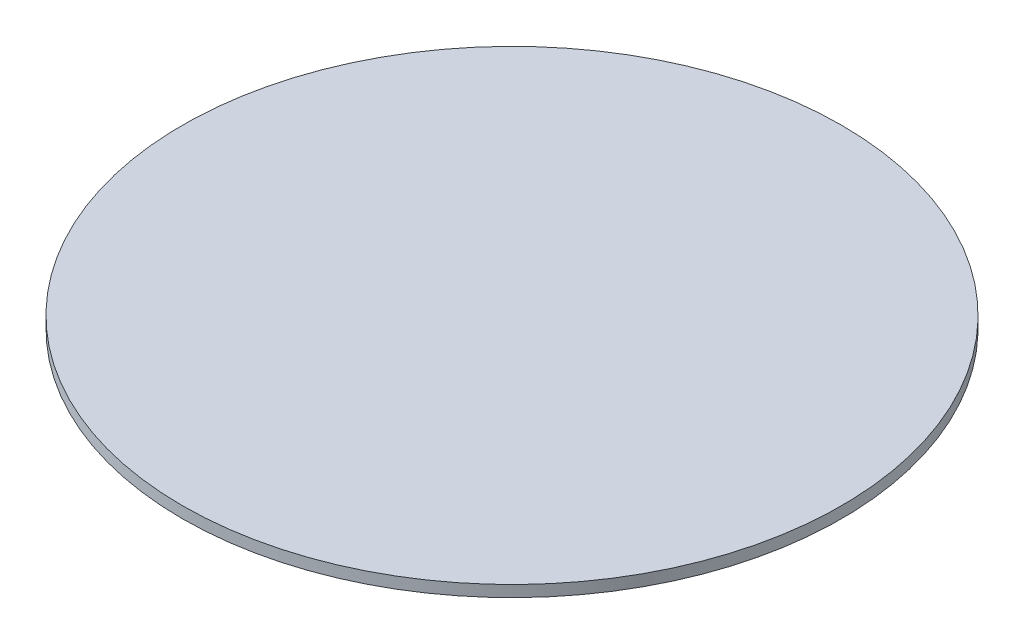
ISO-10303-21;
HEADER;
FILE_DESCRIPTION(('STEP AP214'),'2;1');
FILE_NAME('part.step','',(''),(''),'','','');
FILE_SCHEMA(('AUTOMOTIVE_DESIGN { 1 0 10303 214 1 1 1 1 }'));
ENDSEC;
DATA;
#1=APPLICATION_CONTEXT('core data for automotive mechanical design processes');
#2=APPLICATION_PROTOCOL_DEFINITION('international standard','automotive_design',2000,#1);
#3=PRODUCT_CONTEXT('',#1,'mechanical');
#4=PRODUCT('Part','Part','',(#3));
#5=PRODUCT_RELATED_PRODUCT_CATEGORY('part','',(#4));
#6=PRODUCT_DEFINITION_FORMATION('','',#4);
#7=PRODUCT_DEFINITION_CONTEXT('part definition',#1,'design');
#8=PRODUCT_DEFINITION('design','',#6,#7);
#9=PRODUCT_DEFINITION_SHAPE('','',#8);
#10=(LENGTH_UNIT() NAMED_UNIT(*) SI_UNIT(.MILLI.,.METRE.));
#11=(NAMED_UNIT(*) PLANE_ANGLE_UNIT() SI_UNIT($,.RADIAN.));
#12=(NAMED_UNIT(*) SI_UNIT($,.STERADIAN.) SOLID_ANGLE_UNIT());
#13=UNCERTAINTY_MEASURE_WITH_UNIT(LENGTH_MEASURE(1.E-05),#10,'distance_accuracy_value','');
#14=(GEOMETRIC_REPRESENTATION_CONTEXT(3) GLOBAL_UNCERTAINTY_ASSIGNED_CONTEXT((#13)) GLOBAL_UNIT_ASSIGNED_CONTEXT((#10,
#11,#12)) REPRESENTATION_CONTEXT('',''));
#15=CARTESIAN_POINT('',(0.,0.,0.));
#16=DIRECTION('',(0.,0.,1.));
#17=DIRECTION('',(1.,0.,0.));
#18=AXIS2_PLACEMENT_3D('',#15,#16,#17);
#19=CARTESIAN_POINT('',(0.,3.175,0.));
#20=DIRECTION('',(0.,-1.,0.));
#21=DIRECTION('',(0.,0.,-1.));
#22=AXIS2_PLACEMENT_3D('',#19,#20,#21);
#23=CYLINDRICAL_SURFACE('',#22,92.075);
#24=CARTESIAN_POINT('',(0.,3.175,0.));
#25=DIRECTION('',(0.,1.,0.));
#26=DIRECTION('',(0.,0.,1.));
#27=AXIS2_PLACEMENT_3D('',#24,#25,#26);
#28=CIRCLE('',#27,92.075);
#29=CARTESIAN_POINT('',(0.,3.175,92.075));
#30=VERTEX_POINT('',#29);
#31=EDGE_CURVE('E10',#30,#30,#28,.T.);
#32=ORIENTED_EDGE('',*,*,#31,.F.);
#33=EDGE_LOOP('',(#32));
#34=FACE_BOUND('',#33,.T.);
#35=CARTESIAN_POINT('',(0.,0.,0.));
#36=DIRECTION('',(0.,1.,0.));
#37=DIRECTION('',(0.,0.,1.));
#38=AXIS2_PLACEMENT_3D('',#35,#36,#37);
#39=CIRCLE('',#38,92.075);
#40=CARTESIAN_POINT('',(0.,0.,92.075));
#41=VERTEX_POINT('',#40);
#42=EDGE_CURVE('E35',#41,#41,#39,.T.);
#43=ORIENTED_EDGE('',*,*,#42,.T.);
#44=EDGE_LOOP('',(#43));
#45=FACE_BOUND('',#44,.T.);
#46=ADVANCED_FACE('F32',(#34,#45),#23,.T.);
#47=CARTESIAN_POINT('',(0.,3.175,0.));
#48=DIRECTION('',(0.,1.,0.));
#49=DIRECTION('',(0.,0.,1.));
#50=AXIS2_PLACEMENT_3D('',#47,#48,#49);
#51=PLANE('',#50);
#52=ORIENTED_EDGE('',*,*,#31,.T.);
#53=EDGE_LOOP('',(#52));
#54=FACE_BOUND('',#53,.T.);
#55=ADVANCED_FACE('F47',(#54),#51,.T.);
#56=CARTESIAN_POINT('',(0.,0.,0.));
#57=DIRECTION('',(0.,1.,0.));
#58=DIRECTION('',(0.,0.,1.));
#59=AXIS2_PLACEMENT_3D('',#56,#57,#58);
#60=PLANE('',#59);
#61=ORIENTED_EDGE('',*,*,#42,.F.);
#62=EDGE_LOOP('',(#61));
#63=FACE_BOUND('',#62,.T.);
#64=ADVANCED_FACE('F45',(#63),#60,.F.);
#65=CLOSED_SHELL('',(#46,#55,#64));
#66=MANIFOLD_SOLID_BREP('B2',#65);
#67=ADVANCED_BREP_SHAPE_REPRESENTATION('',(#18,#66),#14);
#68=SHAPE_DEFINITION_REPRESENTATION(#9,#67);
ENDSEC;
END-ISO-10303-21;
